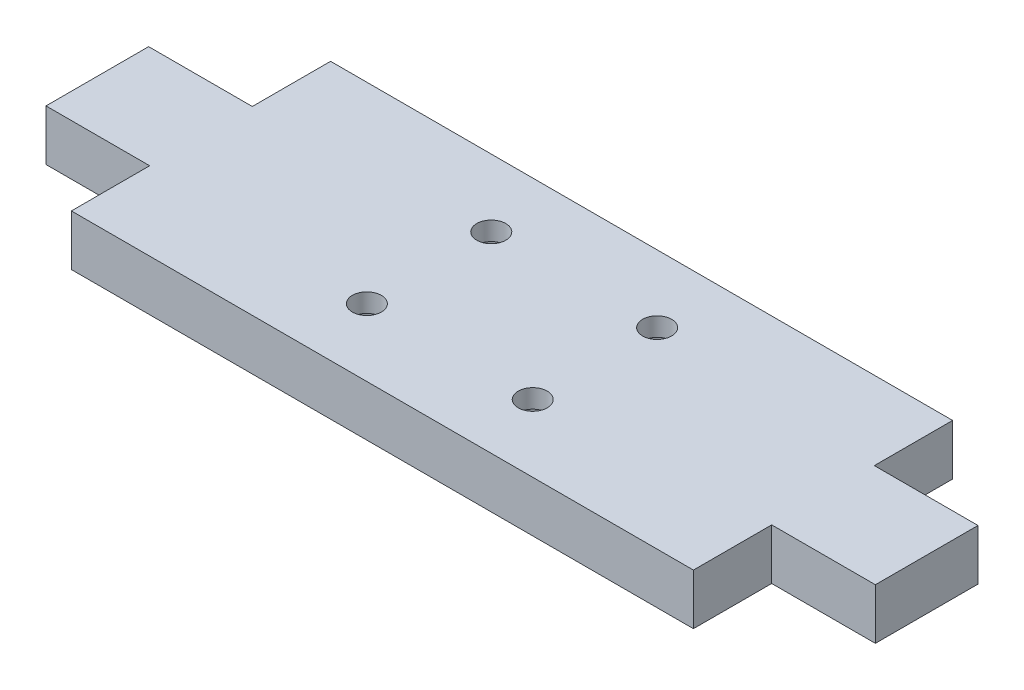
ISO-10303-21;
HEADER;
FILE_DESCRIPTION(('STEP AP214'),'2;1');
FILE_NAME('part.step','',(''),(''),'','','');
FILE_SCHEMA(('AUTOMOTIVE_DESIGN { 1 0 10303 214 1 1 1 1 }'));
ENDSEC;
DATA;
#1=APPLICATION_CONTEXT('core data for automotive mechanical design processes');
#2=APPLICATION_PROTOCOL_DEFINITION('international standard','automotive_design',2000,#1);
#3=PRODUCT_CONTEXT('',#1,'mechanical');
#4=PRODUCT('Part','Part','',(#3));
#5=PRODUCT_RELATED_PRODUCT_CATEGORY('part','',(#4));
#6=PRODUCT_DEFINITION_FORMATION('','',#4);
#7=PRODUCT_DEFINITION_CONTEXT('part definition',#1,'design');
#8=PRODUCT_DEFINITION('design','',#6,#7);
#9=PRODUCT_DEFINITION_SHAPE('','',#8);
#10=(LENGTH_UNIT() NAMED_UNIT(*) SI_UNIT(.MILLI.,.METRE.));
#11=(NAMED_UNIT(*) PLANE_ANGLE_UNIT() SI_UNIT($,.RADIAN.));
#12=(NAMED_UNIT(*) SI_UNIT($,.STERADIAN.) SOLID_ANGLE_UNIT());
#13=UNCERTAINTY_MEASURE_WITH_UNIT(LENGTH_MEASURE(1.E-05),#10,'distance_accuracy_value','');
#14=(GEOMETRIC_REPRESENTATION_CONTEXT(3) GLOBAL_UNCERTAINTY_ASSIGNED_CONTEXT((#13)) GLOBAL_UNIT_ASSIGNED_CONTEXT((#10,
#11,#12)) REPRESENTATION_CONTEXT('',''));
#15=CARTESIAN_POINT('',(0.,0.,0.));
#16=DIRECTION('',(0.,0.,1.));
#17=DIRECTION('',(1.,0.,0.));
#18=AXIS2_PLACEMENT_3D('',#15,#16,#17);
#19=CARTESIAN_POINT('',(30.,-2.45,12.5));
#20=DIRECTION('',(0.,1.,0.));
#21=DIRECTION('',(0.,0.,1.));
#22=AXIS2_PLACEMENT_3D('',#19,#20,#21);
#23=PLANE('',#22);
#24=CARTESIAN_POINT('',(8.,-2.45,-6.));
#25=DIRECTION('',(0.,-1.,0.));
#26=DIRECTION('',(0.,0.,-1.));
#27=AXIS2_PLACEMENT_3D('',#24,#25,#26);
#28=CIRCLE('',#27,2.75);
#29=CARTESIAN_POINT('',(8.,-2.45,-8.75));
#30=VERTEX_POINT('',#29);
#31=EDGE_CURVE('E375',#30,#30,#28,.T.);
#32=ORIENTED_EDGE('',*,*,#31,.F.);
#33=EDGE_LOOP('',(#32));
#34=FACE_BOUND('',#33,.T.);
#35=CARTESIAN_POINT('',(-8.,-2.45,6.));
#36=DIRECTION('',(0.,-1.,0.));
#37=DIRECTION('',(0.,0.,-1.));
#38=AXIS2_PLACEMENT_3D('',#35,#36,#37);
#39=CIRCLE('',#38,2.75);
#40=CARTESIAN_POINT('',(-8.,-2.45,3.25));
#41=VERTEX_POINT('',#40);
#42=EDGE_CURVE('E347',#41,#41,#39,.T.);
#43=ORIENTED_EDGE('',*,*,#42,.F.);
#44=EDGE_LOOP('',(#43));
#45=FACE_BOUND('',#44,.T.);
#46=CARTESIAN_POINT('',(8.,-2.45,6.));
#47=DIRECTION('',(0.,-1.,0.));
#48=DIRECTION('',(0.,0.,-1.));
#49=AXIS2_PLACEMENT_3D('',#46,#47,#48);
#50=CIRCLE('',#49,2.75);
#51=CARTESIAN_POINT('',(8.,-2.45,3.25));
#52=VERTEX_POINT('',#51);
#53=EDGE_CURVE('E333',#52,#52,#50,.T.);
#54=ORIENTED_EDGE('',*,*,#53,.F.);
#55=EDGE_LOOP('',(#54));
#56=FACE_BOUND('',#55,.T.);
#57=DIRECTION('',(0.,0.,-1.));
#58=VECTOR('',#57,1.);
#59=CARTESIAN_POINT('',(-30.,-2.45,12.5));
#60=LINE('',#59,#58);
#61=CARTESIAN_POINT('',(-30.,-2.45,12.5));
#62=VERTEX_POINT('',#61);
#63=CARTESIAN_POINT('',(-30.,-2.45,4.95));
#64=VERTEX_POINT('',#63);
#65=EDGE_CURVE('E217',#62,#64,#60,.T.);
#66=ORIENTED_EDGE('',*,*,#65,.T.);
#67=DIRECTION('',(1.,0.,0.));
#68=VECTOR('',#67,1.);
#69=CARTESIAN_POINT('',(-40.,-2.45,4.95));
#70=LINE('',#69,#68);
#71=CARTESIAN_POINT('',(-40.,-2.45,4.95));
#72=VERTEX_POINT('',#71);
#73=EDGE_CURVE('E55',#72,#64,#70,.T.);
#74=ORIENTED_EDGE('',*,*,#73,.F.);
#75=DIRECTION('',(0.,0.,-1.));
#76=VECTOR('',#75,1.);
#77=CARTESIAN_POINT('',(-40.,-2.45,4.95));
#78=LINE('',#77,#76);
#79=CARTESIAN_POINT('',(-40.,-2.45,-4.95));
#80=VERTEX_POINT('',#79);
#81=EDGE_CURVE('E146',#72,#80,#78,.T.);
#82=ORIENTED_EDGE('',*,*,#81,.T.);
#83=DIRECTION('',(1.,0.,0.));
#84=VECTOR('',#83,1.);
#85=CARTESIAN_POINT('',(-40.,-2.45,-4.95));
#86=LINE('',#85,#84);
#87=CARTESIAN_POINT('',(-30.,-2.45,-4.95));
#88=VERTEX_POINT('',#87);
#89=EDGE_CURVE('E130',#80,#88,#86,.T.);
#90=ORIENTED_EDGE('',*,*,#89,.T.);
#91=CARTESIAN_POINT('',(-30.,-2.45,-12.5));
#92=VERTEX_POINT('',#91);
#93=EDGE_CURVE('E240',#88,#92,#60,.T.);
#94=ORIENTED_EDGE('',*,*,#93,.T.);
#95=DIRECTION('',(-1.,0.,0.));
#96=VECTOR('',#95,1.);
#97=CARTESIAN_POINT('',(30.,-2.45,-12.5));
#98=LINE('',#97,#96);
#99=CARTESIAN_POINT('',(30.,-2.45,-12.5));
#100=VERTEX_POINT('',#99);
#101=EDGE_CURVE('E228',#100,#92,#98,.T.);
#102=ORIENTED_EDGE('',*,*,#101,.F.);
#103=DIRECTION('',(0.,0.,-1.));
#104=VECTOR('',#103,1.);
#105=CARTESIAN_POINT('',(30.,-2.45,12.5));
#106=LINE('',#105,#104);
#107=CARTESIAN_POINT('',(30.,-2.45,-4.95));
#108=VERTEX_POINT('',#107);
#109=EDGE_CURVE('E224',#108,#100,#106,.T.);
#110=ORIENTED_EDGE('',*,*,#109,.F.);
#111=DIRECTION('',(-1.,0.,0.));
#112=VECTOR('',#111,1.);
#113=CARTESIAN_POINT('',(40.,-2.45,-4.95));
#114=LINE('',#113,#112);
#115=CARTESIAN_POINT('',(40.,-2.45,-4.95));
#116=VERTEX_POINT('',#115);
#117=EDGE_CURVE('E190',#116,#108,#114,.T.);
#118=ORIENTED_EDGE('',*,*,#117,.F.);
#119=DIRECTION('',(0.,0.,-1.));
#120=VECTOR('',#119,1.);
#121=CARTESIAN_POINT('',(40.,-2.45,4.95));
#122=LINE('',#121,#120);
#123=CARTESIAN_POINT('',(40.,-2.45,4.95));
#124=VERTEX_POINT('',#123);
#125=EDGE_CURVE('E187',#124,#116,#122,.T.);
#126=ORIENTED_EDGE('',*,*,#125,.F.);
#127=DIRECTION('',(-1.,0.,0.));
#128=VECTOR('',#127,1.);
#129=CARTESIAN_POINT('',(40.,-2.45,4.95));
#130=LINE('',#129,#128);
#131=CARTESIAN_POINT('',(30.,-2.45,4.95));
#132=VERTEX_POINT('',#131);
#133=EDGE_CURVE('E199',#124,#132,#130,.T.);
#134=ORIENTED_EDGE('',*,*,#133,.T.);
#135=CARTESIAN_POINT('',(30.,-2.45,12.5));
#136=VERTEX_POINT('',#135);
#137=EDGE_CURVE('E225',#136,#132,#106,.T.);
#138=ORIENTED_EDGE('',*,*,#137,.F.);
#139=DIRECTION('',(-1.,0.,0.));
#140=VECTOR('',#139,1.);
#141=CARTESIAN_POINT('',(30.,-2.45,12.5));
#142=LINE('',#141,#140);
#143=EDGE_CURVE('E246',#136,#62,#142,.T.);
#144=ORIENTED_EDGE('',*,*,#143,.T.);
#145=EDGE_LOOP('',(#66,#74,#82,#90,#94,#102,#110,#118,#126,#134,#138,#144));
#146=FACE_BOUND('',#145,.T.);
#147=CARTESIAN_POINT('',(-8.,-2.45,-6.));
#148=DIRECTION('',(0.,-1.,0.));
#149=DIRECTION('',(0.,0.,-1.));
#150=AXIS2_PLACEMENT_3D('',#147,#148,#149);
#151=CIRCLE('',#150,2.75);
#152=CARTESIAN_POINT('',(-8.,-2.45,-8.75));
#153=VERTEX_POINT('',#152);
#154=EDGE_CURVE('E361',#153,#153,#151,.T.);
#155=ORIENTED_EDGE('',*,*,#154,.F.);
#156=EDGE_LOOP('',(#155));
#157=FACE_BOUND('',#156,.T.);
#158=ADVANCED_FACE('F39',(#34,#45,#56,#146,#157),#23,.F.);
#159=CARTESIAN_POINT('',(-30.,0.,0.));
#160=DIRECTION('',(-1.,0.,0.));
#161=DIRECTION('',(0.,0.,1.));
#162=AXIS2_PLACEMENT_3D('',#159,#160,#161);
#163=PLANE('',#162);
#164=ORIENTED_EDGE('',*,*,#93,.F.);
#165=DIRECTION('',(0.,1.,0.));
#166=VECTOR('',#165,1.);
#167=CARTESIAN_POINT('',(-30.,-2.45,-4.95));
#168=LINE('',#167,#166);
#169=CARTESIAN_POINT('',(-30.,2.45,-4.95));
#170=VERTEX_POINT('',#169);
#171=EDGE_CURVE('E136',#88,#170,#168,.T.);
#172=ORIENTED_EDGE('',*,*,#171,.T.);
#173=DIRECTION('',(0.,0.,1.));
#174=VECTOR('',#173,1.);
#175=CARTESIAN_POINT('',(-30.,2.45,12.5));
#176=LINE('',#175,#174);
#177=CARTESIAN_POINT('',(-30.,2.45,-12.5));
#178=VERTEX_POINT('',#177);
#179=EDGE_CURVE('E233',#178,#170,#176,.T.);
#180=ORIENTED_EDGE('',*,*,#179,.F.);
#181=DIRECTION('',(0.,1.,0.));
#182=VECTOR('',#181,1.);
#183=CARTESIAN_POINT('',(-30.,-2.45,-12.5));
#184=LINE('',#183,#182);
#185=EDGE_CURVE('E211',#92,#178,#184,.T.);
#186=ORIENTED_EDGE('',*,*,#185,.F.);
#187=EDGE_LOOP('',(#164,#172,#180,#186));
#188=FACE_BOUND('',#187,.T.);
#189=ADVANCED_FACE('F288',(#188),#163,.T.);
#190=CARTESIAN_POINT('',(-30.,2.45,4.95));
#191=VERTEX_POINT('',#190);
#192=CARTESIAN_POINT('',(-30.,2.45,12.5));
#193=VERTEX_POINT('',#192);
#194=EDGE_CURVE('E232',#191,#193,#176,.T.);
#195=ORIENTED_EDGE('',*,*,#194,.F.);
#196=DIRECTION('',(0.,-1.,0.));
#197=VECTOR('',#196,1.);
#198=CARTESIAN_POINT('',(-30.,-2.45,4.95));
#199=LINE('',#198,#197);
#200=EDGE_CURVE('E150',#191,#64,#199,.T.);
#201=ORIENTED_EDGE('',*,*,#200,.T.);
#202=ORIENTED_EDGE('',*,*,#65,.F.);
#203=DIRECTION('',(0.,-1.,0.));
#204=VECTOR('',#203,1.);
#205=CARTESIAN_POINT('',(-30.,-2.45,12.5));
#206=LINE('',#205,#204);
#207=EDGE_CURVE('E237',#193,#62,#206,.T.);
#208=ORIENTED_EDGE('',*,*,#207,.F.);
#209=EDGE_LOOP('',(#195,#201,#202,#208));
#210=FACE_BOUND('',#209,.T.);
#211=ADVANCED_FACE('F262',(#210),#163,.T.);
#212=CARTESIAN_POINT('',(30.,0.,0.));
#213=DIRECTION('',(-1.,0.,0.));
#214=DIRECTION('',(0.,0.,1.));
#215=AXIS2_PLACEMENT_3D('',#212,#213,#214);
#216=PLANE('',#215);
#217=DIRECTION('',(0.,1.,0.));
#218=VECTOR('',#217,1.);
#219=CARTESIAN_POINT('',(30.,-2.45,-4.95));
#220=LINE('',#219,#218);
#221=CARTESIAN_POINT('',(30.,2.45,-4.95));
#222=VERTEX_POINT('',#221);
#223=EDGE_CURVE('E63',#108,#222,#220,.T.);
#224=ORIENTED_EDGE('',*,*,#223,.F.);
#225=ORIENTED_EDGE('',*,*,#109,.T.);
#226=DIRECTION('',(0.,1.,0.));
#227=VECTOR('',#226,1.);
#228=CARTESIAN_POINT('',(30.,-2.45,-12.5));
#229=LINE('',#228,#227);
#230=CARTESIAN_POINT('',(30.,2.45,-12.5));
#231=VERTEX_POINT('',#230);
#232=EDGE_CURVE('E212',#100,#231,#229,.T.);
#233=ORIENTED_EDGE('',*,*,#232,.T.);
#234=DIRECTION('',(0.,0.,1.));
#235=VECTOR('',#234,1.);
#236=CARTESIAN_POINT('',(30.,2.45,12.5));
#237=LINE('',#236,#235);
#238=EDGE_CURVE('E218',#231,#222,#237,.T.);
#239=ORIENTED_EDGE('',*,*,#238,.T.);
#240=EDGE_LOOP('',(#224,#225,#233,#239));
#241=FACE_BOUND('',#240,.T.);
#242=ADVANCED_FACE('F550',(#241),#216,.F.);
#243=DIRECTION('',(0.,-1.,0.));
#244=VECTOR('',#243,1.);
#245=CARTESIAN_POINT('',(30.,-2.45,4.95));
#246=LINE('',#245,#244);
#247=CARTESIAN_POINT('',(30.,2.45,4.95));
#248=VERTEX_POINT('',#247);
#249=EDGE_CURVE('E181',#248,#132,#246,.T.);
#250=ORIENTED_EDGE('',*,*,#249,.F.);
#251=CARTESIAN_POINT('',(30.,2.45,12.5));
#252=VERTEX_POINT('',#251);
#253=EDGE_CURVE('E216',#248,#252,#237,.T.);
#254=ORIENTED_EDGE('',*,*,#253,.T.);
#255=DIRECTION('',(0.,-1.,0.));
#256=VECTOR('',#255,1.);
#257=CARTESIAN_POINT('',(30.,-2.45,12.5));
#258=LINE('',#257,#256);
#259=EDGE_CURVE('E221',#252,#136,#258,.T.);
#260=ORIENTED_EDGE('',*,*,#259,.T.);
#261=ORIENTED_EDGE('',*,*,#137,.T.);
#262=EDGE_LOOP('',(#250,#254,#260,#261));
#263=FACE_BOUND('',#262,.T.);
#264=ADVANCED_FACE('F267',(#263),#216,.F.);
#265=CARTESIAN_POINT('',(30.,-2.45,-12.5));
#266=DIRECTION('',(0.,0.,1.));
#267=DIRECTION('',(1.,0.,0.));
#268=AXIS2_PLACEMENT_3D('',#265,#266,#267);
#269=PLANE('',#268);
#270=ORIENTED_EDGE('',*,*,#185,.T.);
#271=DIRECTION('',(-1.,0.,0.));
#272=VECTOR('',#271,1.);
#273=CARTESIAN_POINT('',(30.,2.45,-12.5));
#274=LINE('',#273,#272);
#275=EDGE_CURVE('E11',#231,#178,#274,.T.);
#276=ORIENTED_EDGE('',*,*,#275,.F.);
#277=ORIENTED_EDGE('',*,*,#232,.F.);
#278=ORIENTED_EDGE('',*,*,#101,.T.);
#279=EDGE_LOOP('',(#270,#276,#277,#278));
#280=FACE_BOUND('',#279,.T.);
#281=ADVANCED_FACE('F41',(#280),#269,.F.);
#282=CARTESIAN_POINT('',(30.,2.45,12.5));
#283=DIRECTION('',(0.,-1.,0.));
#284=DIRECTION('',(0.,0.,-1.));
#285=AXIS2_PLACEMENT_3D('',#282,#283,#284);
#286=PLANE('',#285);
#287=CARTESIAN_POINT('',(8.,2.45,-6.));
#288=DIRECTION('',(0.,-1.,0.));
#289=DIRECTION('',(0.,0.,-1.));
#290=AXIS2_PLACEMENT_3D('',#287,#288,#289);
#291=CIRCLE('',#290,1.4);
#292=CARTESIAN_POINT('',(8.,2.45,-7.4));
#293=VERTEX_POINT('',#292);
#294=EDGE_CURVE('E311',#293,#293,#291,.T.);
#295=ORIENTED_EDGE('',*,*,#294,.T.);
#296=EDGE_LOOP('',(#295));
#297=FACE_BOUND('',#296,.T.);
#298=CARTESIAN_POINT('',(-8.,2.45,-6.));
#299=DIRECTION('',(0.,-1.,0.));
#300=DIRECTION('',(0.,0.,-1.));
#301=AXIS2_PLACEMENT_3D('',#298,#299,#300);
#302=CIRCLE('',#301,1.4);
#303=CARTESIAN_POINT('',(-8.,2.45,-7.4));
#304=VERTEX_POINT('',#303);
#305=EDGE_CURVE('E315',#304,#304,#302,.T.);
#306=ORIENTED_EDGE('',*,*,#305,.T.);
#307=EDGE_LOOP('',(#306));
#308=FACE_BOUND('',#307,.T.);
#309=CARTESIAN_POINT('',(-8.,2.45,6.));
#310=DIRECTION('',(0.,-1.,0.));
#311=DIRECTION('',(0.,0.,-1.));
#312=AXIS2_PLACEMENT_3D('',#309,#310,#311);
#313=CIRCLE('',#312,1.4);
#314=CARTESIAN_POINT('',(-8.,2.45,4.6));
#315=VERTEX_POINT('',#314);
#316=EDGE_CURVE('E319',#315,#315,#313,.T.);
#317=ORIENTED_EDGE('',*,*,#316,.T.);
#318=EDGE_LOOP('',(#317));
#319=FACE_BOUND('',#318,.T.);
#320=CARTESIAN_POINT('',(8.,2.45,6.));
#321=DIRECTION('',(0.,-1.,0.));
#322=DIRECTION('',(0.,0.,-1.));
#323=AXIS2_PLACEMENT_3D('',#320,#321,#322);
#324=CIRCLE('',#323,1.4);
#325=CARTESIAN_POINT('',(8.,2.45,4.6));
#326=VERTEX_POINT('',#325);
#327=EDGE_CURVE('E166',#326,#326,#324,.T.);
#328=ORIENTED_EDGE('',*,*,#327,.T.);
#329=EDGE_LOOP('',(#328));
#330=FACE_BOUND('',#329,.T.);
#331=ORIENTED_EDGE('',*,*,#179,.T.);
#332=DIRECTION('',(1.,0.,0.));
#333=VECTOR('',#332,1.);
#334=CARTESIAN_POINT('',(-40.,2.45,-4.95));
#335=LINE('',#334,#333);
#336=CARTESIAN_POINT('',(-40.,2.45,-4.95));
#337=VERTEX_POINT('',#336);
#338=EDGE_CURVE('E163',#337,#170,#335,.T.);
#339=ORIENTED_EDGE('',*,*,#338,.F.);
#340=DIRECTION('',(0.,0.,1.));
#341=VECTOR('',#340,1.);
#342=CARTESIAN_POINT('',(-40.,2.45,4.95));
#343=LINE('',#342,#341);
#344=CARTESIAN_POINT('',(-40.,2.45,4.95));
#345=VERTEX_POINT('',#344);
#346=EDGE_CURVE('E148',#337,#345,#343,.T.);
#347=ORIENTED_EDGE('',*,*,#346,.T.);
#348=DIRECTION('',(1.,0.,0.));
#349=VECTOR('',#348,1.);
#350=CARTESIAN_POINT('',(-40.,2.45,4.95));
#351=LINE('',#350,#349);
#352=EDGE_CURVE('E171',#345,#191,#351,.T.);
#353=ORIENTED_EDGE('',*,*,#352,.T.);
#354=ORIENTED_EDGE('',*,*,#194,.T.);
#355=DIRECTION('',(-1.,0.,0.));
#356=VECTOR('',#355,1.);
#357=CARTESIAN_POINT('',(30.,2.45,12.5));
#358=LINE('',#357,#356);
#359=EDGE_CURVE('E48',#252,#193,#358,.T.);
#360=ORIENTED_EDGE('',*,*,#359,.F.);
#361=ORIENTED_EDGE('',*,*,#253,.F.);
#362=DIRECTION('',(-1.,0.,0.));
#363=VECTOR('',#362,1.);
#364=CARTESIAN_POINT('',(40.,2.45,4.95));
#365=LINE('',#364,#363);
#366=CARTESIAN_POINT('',(40.,2.45,4.95));
#367=VERTEX_POINT('',#366);
#368=EDGE_CURVE('E203',#367,#248,#365,.T.);
#369=ORIENTED_EDGE('',*,*,#368,.F.);
#370=DIRECTION('',(0.,0.,1.));
#371=VECTOR('',#370,1.);
#372=CARTESIAN_POINT('',(40.,2.45,4.95));
#373=LINE('',#372,#371);
#374=CARTESIAN_POINT('',(40.,2.45,-4.95));
#375=VERTEX_POINT('',#374);
#376=EDGE_CURVE('E180',#375,#367,#373,.T.);
#377=ORIENTED_EDGE('',*,*,#376,.F.);
#378=DIRECTION('',(-1.,0.,0.));
#379=VECTOR('',#378,1.);
#380=CARTESIAN_POINT('',(40.,2.45,-4.95));
#381=LINE('',#380,#379);
#382=EDGE_CURVE('E207',#375,#222,#381,.T.);
#383=ORIENTED_EDGE('',*,*,#382,.T.);
#384=ORIENTED_EDGE('',*,*,#238,.F.);
#385=ORIENTED_EDGE('',*,*,#275,.T.);
#386=EDGE_LOOP('',(#331,#339,#347,#353,#354,#360,#361,#369,#377,#383,#384,#385));
#387=FACE_BOUND('',#386,.T.);
#388=ADVANCED_FACE('F272',(#297,#308,#319,#330,#387),#286,.F.);
#389=CARTESIAN_POINT('',(30.,-2.45,12.5));
#390=DIRECTION('',(0.,0.,-1.));
#391=DIRECTION('',(-1.,0.,0.));
#392=AXIS2_PLACEMENT_3D('',#389,#390,#391);
#393=PLANE('',#392);
#394=ORIENTED_EDGE('',*,*,#207,.T.);
#395=ORIENTED_EDGE('',*,*,#143,.F.);
#396=ORIENTED_EDGE('',*,*,#259,.F.);
#397=ORIENTED_EDGE('',*,*,#359,.T.);
#398=EDGE_LOOP('',(#394,#395,#396,#397));
#399=FACE_BOUND('',#398,.T.);
#400=ADVANCED_FACE('F255',(#399),#393,.F.);
#401=CARTESIAN_POINT('',(40.,-2.45,-4.95));
#402=DIRECTION('',(0.,0.,1.));
#403=DIRECTION('',(0.,-1.,0.));
#404=AXIS2_PLACEMENT_3D('',#401,#402,#403);
#405=PLANE('',#404);
#406=ORIENTED_EDGE('',*,*,#223,.T.);
#407=ORIENTED_EDGE('',*,*,#382,.F.);
#408=DIRECTION('',(0.,1.,0.));
#409=VECTOR('',#408,1.);
#410=CARTESIAN_POINT('',(40.,-2.45,-4.95));
#411=LINE('',#410,#409);
#412=EDGE_CURVE('E176',#116,#375,#411,.T.);
#413=ORIENTED_EDGE('',*,*,#412,.F.);
#414=ORIENTED_EDGE('',*,*,#117,.T.);
#415=EDGE_LOOP('',(#406,#407,#413,#414));
#416=FACE_BOUND('',#415,.T.);
#417=ADVANCED_FACE('F301',(#416),#405,.F.);
#418=CARTESIAN_POINT('',(40.,-2.45,4.95));
#419=DIRECTION('',(0.,0.,-1.));
#420=DIRECTION('',(-1.,0.,0.));
#421=AXIS2_PLACEMENT_3D('',#418,#419,#420);
#422=PLANE('',#421);
#423=ORIENTED_EDGE('',*,*,#249,.T.);
#424=ORIENTED_EDGE('',*,*,#133,.F.);
#425=DIRECTION('',(0.,-1.,0.));
#426=VECTOR('',#425,1.);
#427=CARTESIAN_POINT('',(40.,-2.45,4.95));
#428=LINE('',#427,#426);
#429=EDGE_CURVE('E184',#367,#124,#428,.T.);
#430=ORIENTED_EDGE('',*,*,#429,.F.);
#431=ORIENTED_EDGE('',*,*,#368,.T.);
#432=EDGE_LOOP('',(#423,#424,#430,#431));
#433=FACE_BOUND('',#432,.T.);
#434=ADVANCED_FACE('F269',(#433),#422,.F.);
#435=CARTESIAN_POINT('',(40.,0.,0.));
#436=DIRECTION('',(-1.,0.,0.));
#437=DIRECTION('',(0.,0.,1.));
#438=AXIS2_PLACEMENT_3D('',#435,#436,#437);
#439=PLANE('',#438);
#440=ORIENTED_EDGE('',*,*,#412,.T.);
#441=ORIENTED_EDGE('',*,*,#376,.T.);
#442=ORIENTED_EDGE('',*,*,#429,.T.);
#443=ORIENTED_EDGE('',*,*,#125,.T.);
#444=EDGE_LOOP('',(#440,#441,#442,#443));
#445=FACE_BOUND('',#444,.T.);
#446=ADVANCED_FACE('F285',(#445),#439,.F.);
#447=CARTESIAN_POINT('',(-40.,-2.45,-4.95));
#448=DIRECTION('',(0.,0.,-1.));
#449=DIRECTION('',(0.,1.,0.));
#450=AXIS2_PLACEMENT_3D('',#447,#448,#449);
#451=PLANE('',#450);
#452=ORIENTED_EDGE('',*,*,#171,.F.);
#453=ORIENTED_EDGE('',*,*,#89,.F.);
#454=DIRECTION('',(0.,1.,0.));
#455=VECTOR('',#454,1.);
#456=CARTESIAN_POINT('',(-40.,-2.45,-4.95));
#457=LINE('',#456,#455);
#458=EDGE_CURVE('E133',#80,#337,#457,.T.);
#459=ORIENTED_EDGE('',*,*,#458,.T.);
#460=ORIENTED_EDGE('',*,*,#338,.T.);
#461=EDGE_LOOP('',(#452,#453,#459,#460));
#462=FACE_BOUND('',#461,.T.);
#463=ADVANCED_FACE('F132',(#462),#451,.T.);
#464=CARTESIAN_POINT('',(-40.,-2.45,4.95));
#465=DIRECTION('',(0.,0.,1.));
#466=DIRECTION('',(1.,0.,0.));
#467=AXIS2_PLACEMENT_3D('',#464,#465,#466);
#468=PLANE('',#467);
#469=ORIENTED_EDGE('',*,*,#200,.F.);
#470=ORIENTED_EDGE('',*,*,#352,.F.);
#471=DIRECTION('',(0.,-1.,0.));
#472=VECTOR('',#471,1.);
#473=CARTESIAN_POINT('',(-40.,-2.45,4.95));
#474=LINE('',#473,#472);
#475=EDGE_CURVE('E155',#345,#72,#474,.T.);
#476=ORIENTED_EDGE('',*,*,#475,.T.);
#477=ORIENTED_EDGE('',*,*,#73,.T.);
#478=EDGE_LOOP('',(#469,#470,#476,#477));
#479=FACE_BOUND('',#478,.T.);
#480=ADVANCED_FACE('F276',(#479),#468,.T.);
#481=CARTESIAN_POINT('',(-40.,0.,0.));
#482=DIRECTION('',(1.,0.,0.));
#483=DIRECTION('',(0.,0.,1.));
#484=AXIS2_PLACEMENT_3D('',#481,#482,#483);
#485=PLANE('',#484);
#486=ORIENTED_EDGE('',*,*,#458,.F.);
#487=ORIENTED_EDGE('',*,*,#81,.F.);
#488=ORIENTED_EDGE('',*,*,#475,.F.);
#489=ORIENTED_EDGE('',*,*,#346,.F.);
#490=EDGE_LOOP('',(#486,#487,#488,#489));
#491=FACE_BOUND('',#490,.T.);
#492=ADVANCED_FACE('F144',(#491),#485,.F.);
#493=CARTESIAN_POINT('',(8.,-2.45,6.));
#494=DIRECTION('',(0.,-1.,0.));
#495=DIRECTION('',(0.,0.,-1.));
#496=AXIS2_PLACEMENT_3D('',#493,#494,#495);
#497=CYLINDRICAL_SURFACE('',#496,1.4);
#498=ORIENTED_EDGE('',*,*,#327,.F.);
#499=EDGE_LOOP('',(#498));
#500=FACE_BOUND('',#499,.T.);
#501=CARTESIAN_POINT('',(8.,0.65,6.));
#502=DIRECTION('',(0.,-1.,0.));
#503=DIRECTION('',(0.,0.,-1.));
#504=AXIS2_PLACEMENT_3D('',#501,#502,#503);
#505=CIRCLE('',#504,1.4);
#506=CARTESIAN_POINT('',(8.,0.65,4.6));
#507=VERTEX_POINT('',#506);
#508=EDGE_CURVE('E324',#507,#507,#505,.T.);
#509=ORIENTED_EDGE('',*,*,#508,.T.);
#510=EDGE_LOOP('',(#509));
#511=FACE_BOUND('',#510,.T.);
#512=ADVANCED_FACE('F283',(#500,#511),#497,.F.);
#513=CARTESIAN_POINT('',(9.4,0.65,6.));
#514=DIRECTION('',(0.,1.,0.));
#515=DIRECTION('',(0.,0.,1.));
#516=AXIS2_PLACEMENT_3D('',#513,#514,#515);
#517=PLANE('',#516);
#518=ORIENTED_EDGE('',*,*,#508,.F.);
#519=EDGE_LOOP('',(#518));
#520=FACE_BOUND('',#519,.T.);
#521=CARTESIAN_POINT('',(8.,0.65,6.));
#522=DIRECTION('',(0.,-1.,0.));
#523=DIRECTION('',(0.,0.,-1.));
#524=AXIS2_PLACEMENT_3D('',#521,#522,#523);
#525=CIRCLE('',#524,2.75);
#526=CARTESIAN_POINT('',(8.,0.65,3.25));
#527=VERTEX_POINT('',#526);
#528=EDGE_CURVE('E327',#527,#527,#525,.T.);
#529=ORIENTED_EDGE('',*,*,#528,.T.);
#530=EDGE_LOOP('',(#529));
#531=FACE_BOUND('',#530,.T.);
#532=ADVANCED_FACE('F422',(#520,#531),#517,.F.);
#533=CARTESIAN_POINT('',(8.,-2.45,6.));
#534=DIRECTION('',(0.,-1.,0.));
#535=DIRECTION('',(0.,0.,-1.));
#536=AXIS2_PLACEMENT_3D('',#533,#534,#535);
#537=CYLINDRICAL_SURFACE('',#536,2.75);
#538=ORIENTED_EDGE('',*,*,#528,.F.);
#539=EDGE_LOOP('',(#538));
#540=FACE_BOUND('',#539,.T.);
#541=ORIENTED_EDGE('',*,*,#53,.T.);
#542=EDGE_LOOP('',(#541));
#543=FACE_BOUND('',#542,.T.);
#544=ADVANCED_FACE('F418',(#540,#543),#537,.F.);
#545=CARTESIAN_POINT('',(-8.,-2.45,6.));
#546=DIRECTION('',(0.,-1.,0.));
#547=DIRECTION('',(0.,0.,-1.));
#548=AXIS2_PLACEMENT_3D('',#545,#546,#547);
#549=CYLINDRICAL_SURFACE('',#548,1.4);
#550=ORIENTED_EDGE('',*,*,#316,.F.);
#551=EDGE_LOOP('',(#550));
#552=FACE_BOUND('',#551,.T.);
#553=CARTESIAN_POINT('',(-8.,0.65,6.));
#554=DIRECTION('',(0.,-1.,0.));
#555=DIRECTION('',(0.,0.,-1.));
#556=AXIS2_PLACEMENT_3D('',#553,#554,#555);
#557=CIRCLE('',#556,1.4);
#558=CARTESIAN_POINT('',(-8.,0.65,4.6));
#559=VERTEX_POINT('',#558);
#560=EDGE_CURVE('E339',#559,#559,#557,.T.);
#561=ORIENTED_EDGE('',*,*,#560,.T.);
#562=EDGE_LOOP('',(#561));
#563=FACE_BOUND('',#562,.T.);
#564=ADVANCED_FACE('F414',(#552,#563),#549,.F.);
#565=CARTESIAN_POINT('',(-6.6,0.65,6.));
#566=DIRECTION('',(0.,1.,0.));
#567=DIRECTION('',(0.,0.,1.));
#568=AXIS2_PLACEMENT_3D('',#565,#566,#567);
#569=PLANE('',#568);
#570=ORIENTED_EDGE('',*,*,#560,.F.);
#571=EDGE_LOOP('',(#570));
#572=FACE_BOUND('',#571,.T.);
#573=CARTESIAN_POINT('',(-8.,0.65,6.));
#574=DIRECTION('',(0.,-1.,0.));
#575=DIRECTION('',(0.,0.,-1.));
#576=AXIS2_PLACEMENT_3D('',#573,#574,#575);
#577=CIRCLE('',#576,2.75);
#578=CARTESIAN_POINT('',(-8.,0.65,3.25));
#579=VERTEX_POINT('',#578);
#580=EDGE_CURVE('E343',#579,#579,#577,.T.);
#581=ORIENTED_EDGE('',*,*,#580,.T.);
#582=EDGE_LOOP('',(#581));
#583=FACE_BOUND('',#582,.T.);
#584=ADVANCED_FACE('F410',(#572,#583),#569,.F.);
#585=CARTESIAN_POINT('',(-8.,-2.45,6.));
#586=DIRECTION('',(0.,-1.,0.));
#587=DIRECTION('',(0.,0.,-1.));
#588=AXIS2_PLACEMENT_3D('',#585,#586,#587);
#589=CYLINDRICAL_SURFACE('',#588,2.75);
#590=ORIENTED_EDGE('',*,*,#580,.F.);
#591=EDGE_LOOP('',(#590));
#592=FACE_BOUND('',#591,.T.);
#593=ORIENTED_EDGE('',*,*,#42,.T.);
#594=EDGE_LOOP('',(#593));
#595=FACE_BOUND('',#594,.T.);
#596=ADVANCED_FACE('F406',(#592,#595),#589,.F.);
#597=CARTESIAN_POINT('',(-8.,-2.45,-6.));
#598=DIRECTION('',(0.,-1.,0.));
#599=DIRECTION('',(0.,0.,-1.));
#600=AXIS2_PLACEMENT_3D('',#597,#598,#599);
#601=CYLINDRICAL_SURFACE('',#600,1.4);
#602=ORIENTED_EDGE('',*,*,#305,.F.);
#603=EDGE_LOOP('',(#602));
#604=FACE_BOUND('',#603,.T.);
#605=CARTESIAN_POINT('',(-8.,0.65,-6.));
#606=DIRECTION('',(0.,-1.,0.));
#607=DIRECTION('',(0.,0.,-1.));
#608=AXIS2_PLACEMENT_3D('',#605,#606,#607);
#609=CIRCLE('',#608,1.4);
#610=CARTESIAN_POINT('',(-8.,0.65,-7.4));
#611=VERTEX_POINT('',#610);
#612=EDGE_CURVE('E353',#611,#611,#609,.T.);
#613=ORIENTED_EDGE('',*,*,#612,.T.);
#614=EDGE_LOOP('',(#613));
#615=FACE_BOUND('',#614,.T.);
#616=ADVANCED_FACE('F402',(#604,#615),#601,.F.);
#617=CARTESIAN_POINT('',(-6.6,0.65,-6.));
#618=DIRECTION('',(0.,1.,0.));
#619=DIRECTION('',(0.,0.,1.));
#620=AXIS2_PLACEMENT_3D('',#617,#618,#619);
#621=PLANE('',#620);
#622=ORIENTED_EDGE('',*,*,#612,.F.);
#623=EDGE_LOOP('',(#622));
#624=FACE_BOUND('',#623,.T.);
#625=CARTESIAN_POINT('',(-8.,0.65,-6.));
#626=DIRECTION('',(0.,-1.,0.));
#627=DIRECTION('',(0.,0.,-1.));
#628=AXIS2_PLACEMENT_3D('',#625,#626,#627);
#629=CIRCLE('',#628,2.75);
#630=CARTESIAN_POINT('',(-8.,0.65,-8.75));
#631=VERTEX_POINT('',#630);
#632=EDGE_CURVE('E357',#631,#631,#629,.T.);
#633=ORIENTED_EDGE('',*,*,#632,.T.);
#634=EDGE_LOOP('',(#633));
#635=FACE_BOUND('',#634,.T.);
#636=ADVANCED_FACE('F398',(#624,#635),#621,.F.);
#637=CARTESIAN_POINT('',(-8.,-2.45,-6.));
#638=DIRECTION('',(0.,-1.,0.));
#639=DIRECTION('',(0.,0.,-1.));
#640=AXIS2_PLACEMENT_3D('',#637,#638,#639);
#641=CYLINDRICAL_SURFACE('',#640,2.75);
#642=ORIENTED_EDGE('',*,*,#632,.F.);
#643=EDGE_LOOP('',(#642));
#644=FACE_BOUND('',#643,.T.);
#645=ORIENTED_EDGE('',*,*,#154,.T.);
#646=EDGE_LOOP('',(#645));
#647=FACE_BOUND('',#646,.T.);
#648=ADVANCED_FACE('F394',(#644,#647),#641,.F.);
#649=CARTESIAN_POINT('',(8.,-2.45,-6.));
#650=DIRECTION('',(0.,-1.,0.));
#651=DIRECTION('',(0.,0.,-1.));
#652=AXIS2_PLACEMENT_3D('',#649,#650,#651);
#653=CYLINDRICAL_SURFACE('',#652,1.4);
#654=ORIENTED_EDGE('',*,*,#294,.F.);
#655=EDGE_LOOP('',(#654));
#656=FACE_BOUND('',#655,.T.);
#657=CARTESIAN_POINT('',(8.,0.65,-6.));
#658=DIRECTION('',(0.,-1.,0.));
#659=DIRECTION('',(0.,0.,-1.));
#660=AXIS2_PLACEMENT_3D('',#657,#658,#659);
#661=CIRCLE('',#660,1.4);
#662=CARTESIAN_POINT('',(8.,0.65,-7.4));
#663=VERTEX_POINT('',#662);
#664=EDGE_CURVE('E367',#663,#663,#661,.T.);
#665=ORIENTED_EDGE('',*,*,#664,.T.);
#666=EDGE_LOOP('',(#665));
#667=FACE_BOUND('',#666,.T.);
#668=ADVANCED_FACE('F387',(#656,#667),#653,.F.);
#669=CARTESIAN_POINT('',(9.4,0.65,-6.));
#670=DIRECTION('',(0.,1.,0.));
#671=DIRECTION('',(0.,0.,1.));
#672=AXIS2_PLACEMENT_3D('',#669,#670,#671);
#673=PLANE('',#672);
#674=ORIENTED_EDGE('',*,*,#664,.F.);
#675=EDGE_LOOP('',(#674));
#676=FACE_BOUND('',#675,.T.);
#677=CARTESIAN_POINT('',(8.,0.65,-6.));
#678=DIRECTION('',(0.,-1.,0.));
#679=DIRECTION('',(0.,0.,-1.));
#680=AXIS2_PLACEMENT_3D('',#677,#678,#679);
#681=CIRCLE('',#680,2.75);
#682=CARTESIAN_POINT('',(8.,0.65,-8.75));
#683=VERTEX_POINT('',#682);
#684=EDGE_CURVE('E371',#683,#683,#681,.T.);
#685=ORIENTED_EDGE('',*,*,#684,.T.);
#686=EDGE_LOOP('',(#685));
#687=FACE_BOUND('',#686,.T.);
#688=ADVANCED_FACE('F381',(#676,#687),#673,.F.);
#689=CARTESIAN_POINT('',(8.,-2.45,-6.));
#690=DIRECTION('',(0.,-1.,0.));
#691=DIRECTION('',(0.,0.,-1.));
#692=AXIS2_PLACEMENT_3D('',#689,#690,#691);
#693=CYLINDRICAL_SURFACE('',#692,2.75);
#694=ORIENTED_EDGE('',*,*,#684,.F.);
#695=EDGE_LOOP('',(#694));
#696=FACE_BOUND('',#695,.T.);
#697=ORIENTED_EDGE('',*,*,#31,.T.);
#698=EDGE_LOOP('',(#697));
#699=FACE_BOUND('',#698,.T.);
#700=ADVANCED_FACE('F379',(#696,#699),#693,.F.);
#701=CLOSED_SHELL('',(#158,#189,#211,#242,#264,#281,#388,#400,#417,#434,#446,#463,#480,#492,
#512,#532,#544,#564,#584,#596,#616,#636,#648,#668,#688,#700));
#702=MANIFOLD_SOLID_BREP('B2',#701);
#703=ADVANCED_BREP_SHAPE_REPRESENTATION('',(#18,#702),#14);
#704=SHAPE_DEFINITION_REPRESENTATION(#9,#703);
ENDSEC;
END-ISO-10303-21;
